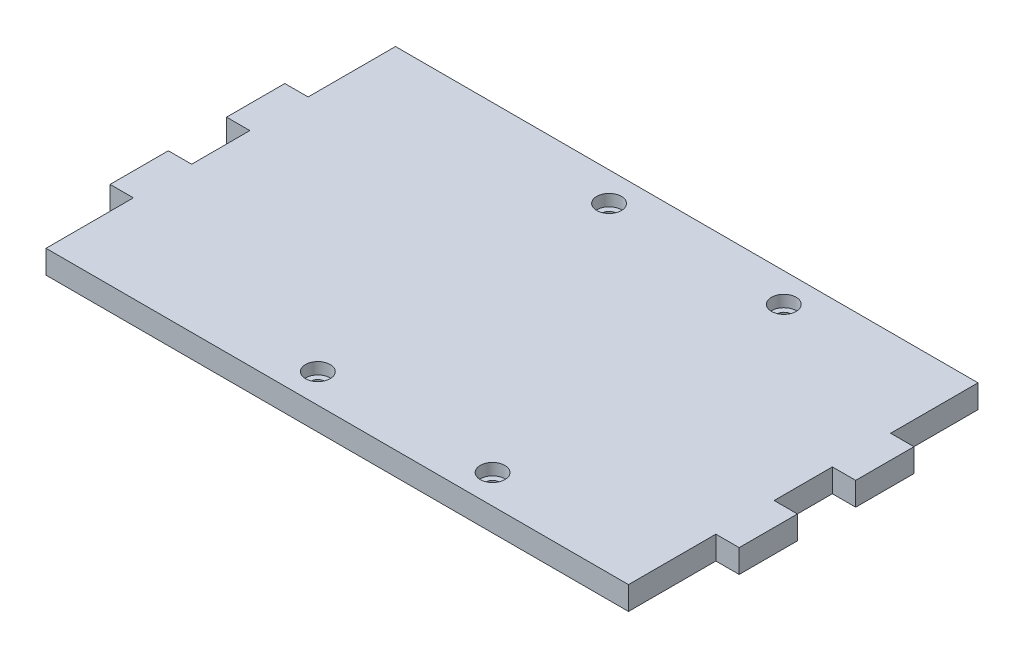
ISO-10303-21;
HEADER;
FILE_DESCRIPTION(('STEP AP214'),'2;1');
FILE_NAME('part.step','',(''),(''),'','','');
FILE_SCHEMA(('AUTOMOTIVE_DESIGN { 1 0 10303 214 1 1 1 1 }'));
ENDSEC;
DATA;
#1=APPLICATION_CONTEXT('core data for automotive mechanical design processes');
#2=APPLICATION_PROTOCOL_DEFINITION('international standard','automotive_design',2000,#1);
#3=PRODUCT_CONTEXT('',#1,'mechanical');
#4=PRODUCT('Part','Part','',(#3));
#5=PRODUCT_RELATED_PRODUCT_CATEGORY('part','',(#4));
#6=PRODUCT_DEFINITION_FORMATION('','',#4);
#7=PRODUCT_DEFINITION_CONTEXT('part definition',#1,'design');
#8=PRODUCT_DEFINITION('design','',#6,#7);
#9=PRODUCT_DEFINITION_SHAPE('','',#8);
#10=(LENGTH_UNIT() NAMED_UNIT(*) SI_UNIT(.MILLI.,.METRE.));
#11=(NAMED_UNIT(*) PLANE_ANGLE_UNIT() SI_UNIT($,.RADIAN.));
#12=(NAMED_UNIT(*) SI_UNIT($,.STERADIAN.) SOLID_ANGLE_UNIT());
#13=UNCERTAINTY_MEASURE_WITH_UNIT(LENGTH_MEASURE(1.E-05),#10,'distance_accuracy_value','');
#14=(GEOMETRIC_REPRESENTATION_CONTEXT(3) GLOBAL_UNCERTAINTY_ASSIGNED_CONTEXT((#13)) GLOBAL_UNIT_ASSIGNED_CONTEXT((#10,
#11,#12)) REPRESENTATION_CONTEXT('',''));
#15=CARTESIAN_POINT('',(0.,0.,0.));
#16=DIRECTION('',(0.,0.,1.));
#17=DIRECTION('',(1.,0.,0.));
#18=AXIS2_PLACEMENT_3D('',#15,#16,#17);
#19=CARTESIAN_POINT('',(32.5,-4.94974746830584,-37.5));
#20=DIRECTION('',(0.,1.,0.));
#21=DIRECTION('',(0.,0.,1.));
#22=AXIS2_PLACEMENT_3D('',#19,#20,#21);
#23=CYLINDRICAL_SURFACE('',#22,1.75);
#24=CARTESIAN_POINT('',(32.5,0.,-37.5));
#25=DIRECTION('',(0.,-1.,0.));
#26=DIRECTION('',(0.,0.,-1.));
#27=AXIS2_PLACEMENT_3D('',#24,#25,#26);
#28=CIRCLE('',#27,1.75);
#29=CARTESIAN_POINT('',(32.5,0.,-39.25));
#30=VERTEX_POINT('',#29);
#31=EDGE_CURVE('E220',#30,#30,#28,.F.);
#32=ORIENTED_EDGE('',*,*,#31,.F.);
#33=EDGE_LOOP('',(#32));
#34=FACE_BOUND('',#33,.T.);
#35=CARTESIAN_POINT('',(32.5,3.,-37.5));
#36=DIRECTION('',(0.,1.,0.));
#37=DIRECTION('',(0.,0.,1.));
#38=AXIS2_PLACEMENT_3D('',#35,#36,#37);
#39=CIRCLE('',#38,1.75);
#40=CARTESIAN_POINT('',(32.5,3.,-35.75));
#41=VERTEX_POINT('',#40);
#42=EDGE_CURVE('E43',#41,#41,#39,.F.);
#43=ORIENTED_EDGE('',*,*,#42,.F.);
#44=EDGE_LOOP('',(#43));
#45=FACE_BOUND('',#44,.T.);
#46=ADVANCED_FACE('F39',(#34,#45),#23,.F.);
#47=CARTESIAN_POINT('',(-12.5,-4.94974746830584,37.5));
#48=DIRECTION('',(0.,1.,0.));
#49=DIRECTION('',(0.,0.,1.));
#50=AXIS2_PLACEMENT_3D('',#47,#48,#49);
#51=CYLINDRICAL_SURFACE('',#50,1.75);
#52=CARTESIAN_POINT('',(-12.5,0.,37.5));
#53=DIRECTION('',(0.,-1.,0.));
#54=DIRECTION('',(0.,0.,-1.));
#55=AXIS2_PLACEMENT_3D('',#52,#53,#54);
#56=CIRCLE('',#55,1.75);
#57=CARTESIAN_POINT('',(-12.5,0.,35.75));
#58=VERTEX_POINT('',#57);
#59=EDGE_CURVE('E355',#58,#58,#56,.F.);
#60=ORIENTED_EDGE('',*,*,#59,.F.);
#61=EDGE_LOOP('',(#60));
#62=FACE_BOUND('',#61,.T.);
#63=CARTESIAN_POINT('',(-12.5,3.,37.5));
#64=DIRECTION('',(0.,1.,0.));
#65=DIRECTION('',(0.,0.,1.));
#66=AXIS2_PLACEMENT_3D('',#63,#64,#65);
#67=CIRCLE('',#66,1.75);
#68=CARTESIAN_POINT('',(-12.5,3.,39.25));
#69=VERTEX_POINT('',#68);
#70=EDGE_CURVE('E348',#69,#69,#67,.F.);
#71=ORIENTED_EDGE('',*,*,#70,.F.);
#72=EDGE_LOOP('',(#71));
#73=FACE_BOUND('',#72,.T.);
#74=ADVANCED_FACE('F453',(#62,#73),#51,.F.);
#75=CARTESIAN_POINT('',(32.5,-4.94974746830584,37.5));
#76=DIRECTION('',(0.,1.,0.));
#77=DIRECTION('',(0.,0.,1.));
#78=AXIS2_PLACEMENT_3D('',#75,#76,#77);
#79=CYLINDRICAL_SURFACE('',#78,1.75);
#80=CARTESIAN_POINT('',(32.5,0.,37.5));
#81=DIRECTION('',(0.,-1.,0.));
#82=DIRECTION('',(0.,0.,-1.));
#83=AXIS2_PLACEMENT_3D('',#80,#81,#82);
#84=CIRCLE('',#83,1.75);
#85=CARTESIAN_POINT('',(32.5,0.,35.75));
#86=VERTEX_POINT('',#85);
#87=EDGE_CURVE('E360',#86,#86,#84,.F.);
#88=ORIENTED_EDGE('',*,*,#87,.F.);
#89=EDGE_LOOP('',(#88));
#90=FACE_BOUND('',#89,.T.);
#91=CARTESIAN_POINT('',(32.5,3.,37.5));
#92=DIRECTION('',(0.,1.,0.));
#93=DIRECTION('',(0.,0.,1.));
#94=AXIS2_PLACEMENT_3D('',#91,#92,#93);
#95=CIRCLE('',#94,1.75);
#96=CARTESIAN_POINT('',(32.5,3.,39.25));
#97=VERTEX_POINT('',#96);
#98=EDGE_CURVE('E344',#97,#97,#95,.F.);
#99=ORIENTED_EDGE('',*,*,#98,.F.);
#100=EDGE_LOOP('',(#99));
#101=FACE_BOUND('',#100,.T.);
#102=ADVANCED_FACE('F459',(#90,#101),#79,.F.);
#103=CARTESIAN_POINT('',(-12.5,-4.94974746830584,-37.5));
#104=DIRECTION('',(0.,1.,0.));
#105=DIRECTION('',(0.,0.,1.));
#106=AXIS2_PLACEMENT_3D('',#103,#104,#105);
#107=CYLINDRICAL_SURFACE('',#106,1.75);
#108=CARTESIAN_POINT('',(-12.5,0.,-37.5));
#109=DIRECTION('',(0.,-1.,0.));
#110=DIRECTION('',(0.,0.,-1.));
#111=AXIS2_PLACEMENT_3D('',#108,#109,#110);
#112=CIRCLE('',#111,1.75);
#113=CARTESIAN_POINT('',(-12.5,0.,-39.25));
#114=VERTEX_POINT('',#113);
#115=EDGE_CURVE('E366',#114,#114,#112,.F.);
#116=ORIENTED_EDGE('',*,*,#115,.F.);
#117=EDGE_LOOP('',(#116));
#118=FACE_BOUND('',#117,.T.);
#119=CARTESIAN_POINT('',(-12.5,3.,-37.5));
#120=DIRECTION('',(0.,1.,0.));
#121=DIRECTION('',(0.,0.,1.));
#122=AXIS2_PLACEMENT_3D('',#119,#120,#121);
#123=CIRCLE('',#122,1.75);
#124=CARTESIAN_POINT('',(-12.5,3.,-35.75));
#125=VERTEX_POINT('',#124);
#126=EDGE_CURVE('E340',#125,#125,#123,.F.);
#127=ORIENTED_EDGE('',*,*,#126,.F.);
#128=EDGE_LOOP('',(#127));
#129=FACE_BOUND('',#128,.T.);
#130=ADVANCED_FACE('F482',(#118,#129),#107,.F.);
#131=CARTESIAN_POINT('',(75.,6.,-22.5));
#132=DIRECTION('',(-1.,0.,0.));
#133=DIRECTION('',(0.,0.,1.));
#134=AXIS2_PLACEMENT_3D('',#131,#132,#133);
#135=PLANE('',#134);
#136=DIRECTION('',(0.,0.,-1.));
#137=VECTOR('',#136,1.);
#138=CARTESIAN_POINT('',(75.,0.,-22.5));
#139=LINE('',#138,#137);
#140=CARTESIAN_POINT('',(75.,0.,-22.5));
#141=VERTEX_POINT('',#140);
#142=CARTESIAN_POINT('',(75.,0.,-45.));
#143=VERTEX_POINT('',#142);
#144=EDGE_CURVE('E215',#141,#143,#139,.T.);
#145=ORIENTED_EDGE('',*,*,#144,.T.);
#146=DIRECTION('',(0.,-1.,0.));
#147=VECTOR('',#146,1.);
#148=CARTESIAN_POINT('',(75.,6.,-45.));
#149=LINE('',#148,#147);
#150=CARTESIAN_POINT('',(75.,6.,-45.));
#151=VERTEX_POINT('',#150);
#152=EDGE_CURVE('E11',#151,#143,#149,.T.);
#153=ORIENTED_EDGE('',*,*,#152,.F.);
#154=DIRECTION('',(0.,0.,-1.));
#155=VECTOR('',#154,1.);
#156=CARTESIAN_POINT('',(75.,6.,-22.5));
#157=LINE('',#156,#155);
#158=CARTESIAN_POINT('',(75.,6.,-22.5));
#159=VERTEX_POINT('',#158);
#160=EDGE_CURVE('E274',#159,#151,#157,.T.);
#161=ORIENTED_EDGE('',*,*,#160,.F.);
#162=DIRECTION('',(0.,-1.,0.));
#163=VECTOR('',#162,1.);
#164=CARTESIAN_POINT('',(75.,6.,-22.5));
#165=LINE('',#164,#163);
#166=EDGE_CURVE('E211',#159,#141,#165,.T.);
#167=ORIENTED_EDGE('',*,*,#166,.T.);
#168=EDGE_LOOP('',(#145,#153,#161,#167));
#169=FACE_BOUND('',#168,.T.);
#170=ADVANCED_FACE('F41',(#169),#135,.F.);
#171=CARTESIAN_POINT('',(-75.,6.,-45.));
#172=DIRECTION('',(0.,0.,1.));
#173=DIRECTION('',(1.,0.,0.));
#174=AXIS2_PLACEMENT_3D('',#171,#172,#173);
#175=PLANE('',#174);
#176=DIRECTION('',(-1.,0.,0.));
#177=VECTOR('',#176,1.);
#178=CARTESIAN_POINT('',(-75.,0.,-45.));
#179=LINE('',#178,#177);
#180=CARTESIAN_POINT('',(-75.,0.,-45.));
#181=VERTEX_POINT('',#180);
#182=EDGE_CURVE('E219',#143,#181,#179,.T.);
#183=ORIENTED_EDGE('',*,*,#182,.T.);
#184=DIRECTION('',(0.,-1.,0.));
#185=VECTOR('',#184,1.);
#186=CARTESIAN_POINT('',(-75.,6.,-45.));
#187=LINE('',#186,#185);
#188=CARTESIAN_POINT('',(-75.,6.,-45.));
#189=VERTEX_POINT('',#188);
#190=EDGE_CURVE('E50',#189,#181,#187,.T.);
#191=ORIENTED_EDGE('',*,*,#190,.F.);
#192=DIRECTION('',(-1.,0.,0.));
#193=VECTOR('',#192,1.);
#194=CARTESIAN_POINT('',(-75.,6.,-45.));
#195=LINE('',#194,#193);
#196=EDGE_CURVE('E138',#151,#189,#195,.T.);
#197=ORIENTED_EDGE('',*,*,#196,.F.);
#198=ORIENTED_EDGE('',*,*,#152,.T.);
#199=EDGE_LOOP('',(#183,#191,#197,#198));
#200=FACE_BOUND('',#199,.T.);
#201=ADVANCED_FACE('F516',(#200),#175,.F.);
#202=CARTESIAN_POINT('',(-75.,6.,-22.5));
#203=DIRECTION('',(1.,0.,0.));
#204=DIRECTION('',(0.,0.,-1.));
#205=AXIS2_PLACEMENT_3D('',#202,#203,#204);
#206=PLANE('',#205);
#207=DIRECTION('',(0.,0.,1.));
#208=VECTOR('',#207,1.);
#209=CARTESIAN_POINT('',(-75.,0.,-22.5));
#210=LINE('',#209,#208);
#211=CARTESIAN_POINT('',(-75.,0.,-22.5));
#212=VERTEX_POINT('',#211);
#213=EDGE_CURVE('E223',#181,#212,#210,.T.);
#214=ORIENTED_EDGE('',*,*,#213,.T.);
#215=DIRECTION('',(0.,-1.,0.));
#216=VECTOR('',#215,1.);
#217=CARTESIAN_POINT('',(-75.,6.,-22.5));
#218=LINE('',#217,#216);
#219=CARTESIAN_POINT('',(-75.,6.,-22.5));
#220=VERTEX_POINT('',#219);
#221=EDGE_CURVE('E333',#220,#212,#218,.T.);
#222=ORIENTED_EDGE('',*,*,#221,.F.);
#223=DIRECTION('',(0.,0.,1.));
#224=VECTOR('',#223,1.);
#225=CARTESIAN_POINT('',(-75.,6.,-22.5));
#226=LINE('',#225,#224);
#227=EDGE_CURVE('E382',#189,#220,#226,.T.);
#228=ORIENTED_EDGE('',*,*,#227,.F.);
#229=ORIENTED_EDGE('',*,*,#190,.T.);
#230=EDGE_LOOP('',(#214,#222,#228,#229));
#231=FACE_BOUND('',#230,.T.);
#232=ADVANCED_FACE('F523',(#231),#206,.F.);
#233=CARTESIAN_POINT('',(-75.,6.,-22.5));
#234=DIRECTION('',(0.,0.,1.));
#235=DIRECTION('',(1.,0.,0.));
#236=AXIS2_PLACEMENT_3D('',#233,#234,#235);
#237=PLANE('',#236);
#238=DIRECTION('',(-1.,0.,0.));
#239=VECTOR('',#238,1.);
#240=CARTESIAN_POINT('',(-75.,0.,-22.5));
#241=LINE('',#240,#239);
#242=CARTESIAN_POINT('',(-81.,0.,-22.5));
#243=VERTEX_POINT('',#242);
#244=EDGE_CURVE('E226',#212,#243,#241,.T.);
#245=ORIENTED_EDGE('',*,*,#244,.T.);
#246=DIRECTION('',(0.,-1.,0.));
#247=VECTOR('',#246,1.);
#248=CARTESIAN_POINT('',(-81.,6.,-22.5));
#249=LINE('',#248,#247);
#250=CARTESIAN_POINT('',(-81.,6.,-22.5));
#251=VERTEX_POINT('',#250);
#252=EDGE_CURVE('E329',#251,#243,#249,.T.);
#253=ORIENTED_EDGE('',*,*,#252,.F.);
#254=DIRECTION('',(-1.,0.,0.));
#255=VECTOR('',#254,1.);
#256=CARTESIAN_POINT('',(-75.,6.,-22.5));
#257=LINE('',#256,#255);
#258=EDGE_CURVE('E385',#220,#251,#257,.T.);
#259=ORIENTED_EDGE('',*,*,#258,.F.);
#260=ORIENTED_EDGE('',*,*,#221,.T.);
#261=EDGE_LOOP('',(#245,#253,#259,#260));
#262=FACE_BOUND('',#261,.T.);
#263=ADVANCED_FACE('F527',(#262),#237,.F.);
#264=CARTESIAN_POINT('',(-81.,6.,-22.5));
#265=DIRECTION('',(1.,0.,0.));
#266=DIRECTION('',(0.,0.,-1.));
#267=AXIS2_PLACEMENT_3D('',#264,#265,#266);
#268=PLANE('',#267);
#269=DIRECTION('',(0.,0.,1.));
#270=VECTOR('',#269,1.);
#271=CARTESIAN_POINT('',(-81.,0.,-22.5));
#272=LINE('',#271,#270);
#273=CARTESIAN_POINT('',(-81.,0.,-7.50000000000003));
#274=VERTEX_POINT('',#273);
#275=EDGE_CURVE('E229',#243,#274,#272,.T.);
#276=ORIENTED_EDGE('',*,*,#275,.T.);
#277=DIRECTION('',(0.,-1.,0.));
#278=VECTOR('',#277,1.);
#279=CARTESIAN_POINT('',(-81.,6.,-7.50000000000003));
#280=LINE('',#279,#278);
#281=CARTESIAN_POINT('',(-81.,6.,-7.50000000000003));
#282=VERTEX_POINT('',#281);
#283=EDGE_CURVE('E325',#282,#274,#280,.T.);
#284=ORIENTED_EDGE('',*,*,#283,.F.);
#285=DIRECTION('',(0.,0.,1.));
#286=VECTOR('',#285,1.);
#287=CARTESIAN_POINT('',(-81.,6.,-22.5));
#288=LINE('',#287,#286);
#289=EDGE_CURVE('E388',#251,#282,#288,.T.);
#290=ORIENTED_EDGE('',*,*,#289,.F.);
#291=ORIENTED_EDGE('',*,*,#252,.T.);
#292=EDGE_LOOP('',(#276,#284,#290,#291));
#293=FACE_BOUND('',#292,.T.);
#294=ADVANCED_FACE('F533',(#293),#268,.F.);
#295=CARTESIAN_POINT('',(-75.,6.,-7.50000000000003));
#296=DIRECTION('',(0.,0.,-1.));
#297=DIRECTION('',(-1.,0.,0.));
#298=AXIS2_PLACEMENT_3D('',#295,#296,#297);
#299=PLANE('',#298);
#300=DIRECTION('',(1.,0.,0.));
#301=VECTOR('',#300,1.);
#302=CARTESIAN_POINT('',(-75.,0.,-7.50000000000003));
#303=LINE('',#302,#301);
#304=CARTESIAN_POINT('',(-75.,0.,-7.50000000000003));
#305=VERTEX_POINT('',#304);
#306=EDGE_CURVE('E232',#274,#305,#303,.T.);
#307=ORIENTED_EDGE('',*,*,#306,.T.);
#308=DIRECTION('',(0.,-1.,0.));
#309=VECTOR('',#308,1.);
#310=CARTESIAN_POINT('',(-75.,6.,-7.50000000000003));
#311=LINE('',#310,#309);
#312=CARTESIAN_POINT('',(-75.,6.,-7.50000000000003));
#313=VERTEX_POINT('',#312);
#314=EDGE_CURVE('E321',#313,#305,#311,.T.);
#315=ORIENTED_EDGE('',*,*,#314,.F.);
#316=DIRECTION('',(1.,0.,0.));
#317=VECTOR('',#316,1.);
#318=CARTESIAN_POINT('',(-75.,6.,-7.50000000000003));
#319=LINE('',#318,#317);
#320=EDGE_CURVE('E391',#282,#313,#319,.T.);
#321=ORIENTED_EDGE('',*,*,#320,.F.);
#322=ORIENTED_EDGE('',*,*,#283,.T.);
#323=EDGE_LOOP('',(#307,#315,#321,#322));
#324=FACE_BOUND('',#323,.T.);
#325=ADVANCED_FACE('F537',(#324),#299,.F.);
#326=CARTESIAN_POINT('',(-75.,6.,7.49999999999997));
#327=DIRECTION('',(1.,0.,0.));
#328=DIRECTION('',(0.,0.,-1.));
#329=AXIS2_PLACEMENT_3D('',#326,#327,#328);
#330=PLANE('',#329);
#331=DIRECTION('',(0.,0.,1.));
#332=VECTOR('',#331,1.);
#333=CARTESIAN_POINT('',(-75.,0.,7.49999999999997));
#334=LINE('',#333,#332);
#335=CARTESIAN_POINT('',(-75.,0.,7.49999999999997));
#336=VERTEX_POINT('',#335);
#337=EDGE_CURVE('E235',#305,#336,#334,.T.);
#338=ORIENTED_EDGE('',*,*,#337,.T.);
#339=DIRECTION('',(0.,-1.,0.));
#340=VECTOR('',#339,1.);
#341=CARTESIAN_POINT('',(-75.,6.,7.49999999999997));
#342=LINE('',#341,#340);
#343=CARTESIAN_POINT('',(-75.,6.,7.49999999999997));
#344=VERTEX_POINT('',#343);
#345=EDGE_CURVE('E317',#344,#336,#342,.T.);
#346=ORIENTED_EDGE('',*,*,#345,.F.);
#347=DIRECTION('',(0.,0.,1.));
#348=VECTOR('',#347,1.);
#349=CARTESIAN_POINT('',(-75.,6.,7.49999999999997));
#350=LINE('',#349,#348);
#351=EDGE_CURVE('E394',#313,#344,#350,.T.);
#352=ORIENTED_EDGE('',*,*,#351,.F.);
#353=ORIENTED_EDGE('',*,*,#314,.T.);
#354=EDGE_LOOP('',(#338,#346,#352,#353));
#355=FACE_BOUND('',#354,.T.);
#356=ADVANCED_FACE('F541',(#355),#330,.F.);
#357=CARTESIAN_POINT('',(-75.,6.,7.49999999999997));
#358=DIRECTION('',(0.,0.,1.));
#359=DIRECTION('',(1.,0.,0.));
#360=AXIS2_PLACEMENT_3D('',#357,#358,#359);
#361=PLANE('',#360);
#362=DIRECTION('',(-1.,0.,0.));
#363=VECTOR('',#362,1.);
#364=CARTESIAN_POINT('',(-75.,0.,7.49999999999997));
#365=LINE('',#364,#363);
#366=CARTESIAN_POINT('',(-81.,0.,7.49999999999997));
#367=VERTEX_POINT('',#366);
#368=EDGE_CURVE('E238',#336,#367,#365,.T.);
#369=ORIENTED_EDGE('',*,*,#368,.T.);
#370=DIRECTION('',(0.,-1.,0.));
#371=VECTOR('',#370,1.);
#372=CARTESIAN_POINT('',(-81.,6.,7.49999999999997));
#373=LINE('',#372,#371);
#374=CARTESIAN_POINT('',(-81.,6.,7.49999999999997));
#375=VERTEX_POINT('',#374);
#376=EDGE_CURVE('E313',#375,#367,#373,.T.);
#377=ORIENTED_EDGE('',*,*,#376,.F.);
#378=DIRECTION('',(-1.,0.,0.));
#379=VECTOR('',#378,1.);
#380=CARTESIAN_POINT('',(-75.,6.,7.49999999999997));
#381=LINE('',#380,#379);
#382=EDGE_CURVE('E397',#344,#375,#381,.T.);
#383=ORIENTED_EDGE('',*,*,#382,.F.);
#384=ORIENTED_EDGE('',*,*,#345,.T.);
#385=EDGE_LOOP('',(#369,#377,#383,#384));
#386=FACE_BOUND('',#385,.T.);
#387=ADVANCED_FACE('F545',(#386),#361,.F.);
#388=CARTESIAN_POINT('',(-81.,6.,7.49999999999997));
#389=DIRECTION('',(1.,0.,0.));
#390=DIRECTION('',(0.,0.,-1.));
#391=AXIS2_PLACEMENT_3D('',#388,#389,#390);
#392=PLANE('',#391);
#393=DIRECTION('',(0.,0.,1.));
#394=VECTOR('',#393,1.);
#395=CARTESIAN_POINT('',(-81.,0.,7.49999999999997));
#396=LINE('',#395,#394);
#397=CARTESIAN_POINT('',(-81.,0.,22.4999999999999));
#398=VERTEX_POINT('',#397);
#399=EDGE_CURVE('E241',#367,#398,#396,.T.);
#400=ORIENTED_EDGE('',*,*,#399,.T.);
#401=DIRECTION('',(0.,-1.,0.));
#402=VECTOR('',#401,1.);
#403=CARTESIAN_POINT('',(-81.,6.,22.4999999999999));
#404=LINE('',#403,#402);
#405=CARTESIAN_POINT('',(-81.,6.,22.4999999999999));
#406=VERTEX_POINT('',#405);
#407=EDGE_CURVE('E309',#406,#398,#404,.T.);
#408=ORIENTED_EDGE('',*,*,#407,.F.);
#409=DIRECTION('',(0.,0.,1.));
#410=VECTOR('',#409,1.);
#411=CARTESIAN_POINT('',(-81.,6.,7.49999999999997));
#412=LINE('',#411,#410);
#413=EDGE_CURVE('E400',#375,#406,#412,.T.);
#414=ORIENTED_EDGE('',*,*,#413,.F.);
#415=ORIENTED_EDGE('',*,*,#376,.T.);
#416=EDGE_LOOP('',(#400,#408,#414,#415));
#417=FACE_BOUND('',#416,.T.);
#418=ADVANCED_FACE('F549',(#417),#392,.F.);
#419=CARTESIAN_POINT('',(-75.,6.,22.4999999999999));
#420=DIRECTION('',(0.,0.,-1.));
#421=DIRECTION('',(-1.,0.,0.));
#422=AXIS2_PLACEMENT_3D('',#419,#420,#421);
#423=PLANE('',#422);
#424=DIRECTION('',(1.,0.,0.));
#425=VECTOR('',#424,1.);
#426=CARTESIAN_POINT('',(-75.,0.,22.4999999999999));
#427=LINE('',#426,#425);
#428=CARTESIAN_POINT('',(-75.,0.,22.4999999999999));
#429=VERTEX_POINT('',#428);
#430=EDGE_CURVE('E244',#398,#429,#427,.T.);
#431=ORIENTED_EDGE('',*,*,#430,.T.);
#432=DIRECTION('',(0.,-1.,0.));
#433=VECTOR('',#432,1.);
#434=CARTESIAN_POINT('',(-75.,6.,22.4999999999999));
#435=LINE('',#434,#433);
#436=CARTESIAN_POINT('',(-75.,6.,22.4999999999999));
#437=VERTEX_POINT('',#436);
#438=EDGE_CURVE('E305',#437,#429,#435,.T.);
#439=ORIENTED_EDGE('',*,*,#438,.F.);
#440=DIRECTION('',(1.,0.,0.));
#441=VECTOR('',#440,1.);
#442=CARTESIAN_POINT('',(-75.,6.,22.4999999999999));
#443=LINE('',#442,#441);
#444=EDGE_CURVE('E403',#406,#437,#443,.T.);
#445=ORIENTED_EDGE('',*,*,#444,.F.);
#446=ORIENTED_EDGE('',*,*,#407,.T.);
#447=EDGE_LOOP('',(#431,#439,#445,#446));
#448=FACE_BOUND('',#447,.T.);
#449=ADVANCED_FACE('F553',(#448),#423,.F.);
#450=CARTESIAN_POINT('',(-75.,6.,45.));
#451=DIRECTION('',(1.,0.,0.));
#452=DIRECTION('',(0.,0.,-1.));
#453=AXIS2_PLACEMENT_3D('',#450,#451,#452);
#454=PLANE('',#453);
#455=DIRECTION('',(0.,0.,1.));
#456=VECTOR('',#455,1.);
#457=CARTESIAN_POINT('',(-75.,0.,45.));
#458=LINE('',#457,#456);
#459=CARTESIAN_POINT('',(-75.,0.,45.));
#460=VERTEX_POINT('',#459);
#461=EDGE_CURVE('E247',#429,#460,#458,.T.);
#462=ORIENTED_EDGE('',*,*,#461,.T.);
#463=DIRECTION('',(0.,-1.,0.));
#464=VECTOR('',#463,1.);
#465=CARTESIAN_POINT('',(-75.,6.,45.));
#466=LINE('',#465,#464);
#467=CARTESIAN_POINT('',(-75.,6.,45.));
#468=VERTEX_POINT('',#467);
#469=EDGE_CURVE('E301',#468,#460,#466,.T.);
#470=ORIENTED_EDGE('',*,*,#469,.F.);
#471=DIRECTION('',(0.,0.,1.));
#472=VECTOR('',#471,1.);
#473=CARTESIAN_POINT('',(-75.,6.,45.));
#474=LINE('',#473,#472);
#475=EDGE_CURVE('E406',#437,#468,#474,.T.);
#476=ORIENTED_EDGE('',*,*,#475,.F.);
#477=ORIENTED_EDGE('',*,*,#438,.T.);
#478=EDGE_LOOP('',(#462,#470,#476,#477));
#479=FACE_BOUND('',#478,.T.);
#480=ADVANCED_FACE('F557',(#479),#454,.F.);
#481=CARTESIAN_POINT('',(-75.,6.,45.));
#482=DIRECTION('',(0.,0.,-1.));
#483=DIRECTION('',(-1.,0.,0.));
#484=AXIS2_PLACEMENT_3D('',#481,#482,#483);
#485=PLANE('',#484);
#486=DIRECTION('',(1.,0.,0.));
#487=VECTOR('',#486,1.);
#488=CARTESIAN_POINT('',(-75.,0.,45.));
#489=LINE('',#488,#487);
#490=CARTESIAN_POINT('',(75.,0.,45.));
#491=VERTEX_POINT('',#490);
#492=EDGE_CURVE('E250',#460,#491,#489,.T.);
#493=ORIENTED_EDGE('',*,*,#492,.T.);
#494=DIRECTION('',(0.,-1.,0.));
#495=VECTOR('',#494,1.);
#496=CARTESIAN_POINT('',(75.,6.,45.));
#497=LINE('',#496,#495);
#498=CARTESIAN_POINT('',(75.,6.,45.));
#499=VERTEX_POINT('',#498);
#500=EDGE_CURVE('E297',#499,#491,#497,.T.);
#501=ORIENTED_EDGE('',*,*,#500,.F.);
#502=DIRECTION('',(1.,0.,0.));
#503=VECTOR('',#502,1.);
#504=CARTESIAN_POINT('',(-75.,6.,45.));
#505=LINE('',#504,#503);
#506=EDGE_CURVE('E409',#468,#499,#505,.T.);
#507=ORIENTED_EDGE('',*,*,#506,.F.);
#508=ORIENTED_EDGE('',*,*,#469,.T.);
#509=EDGE_LOOP('',(#493,#501,#507,#508));
#510=FACE_BOUND('',#509,.T.);
#511=ADVANCED_FACE('F561',(#510),#485,.F.);
#512=CARTESIAN_POINT('',(75.,6.,45.));
#513=DIRECTION('',(-1.,0.,0.));
#514=DIRECTION('',(0.,0.,1.));
#515=AXIS2_PLACEMENT_3D('',#512,#513,#514);
#516=PLANE('',#515);
#517=DIRECTION('',(0.,0.,-1.));
#518=VECTOR('',#517,1.);
#519=CARTESIAN_POINT('',(75.,0.,45.));
#520=LINE('',#519,#518);
#521=CARTESIAN_POINT('',(75.,0.,22.5));
#522=VERTEX_POINT('',#521);
#523=EDGE_CURVE('E253',#491,#522,#520,.T.);
#524=ORIENTED_EDGE('',*,*,#523,.T.);
#525=DIRECTION('',(0.,-1.,0.));
#526=VECTOR('',#525,1.);
#527=CARTESIAN_POINT('',(75.,6.,22.5));
#528=LINE('',#527,#526);
#529=CARTESIAN_POINT('',(75.,6.,22.5));
#530=VERTEX_POINT('',#529);
#531=EDGE_CURVE('E293',#530,#522,#528,.T.);
#532=ORIENTED_EDGE('',*,*,#531,.F.);
#533=DIRECTION('',(0.,0.,-1.));
#534=VECTOR('',#533,1.);
#535=CARTESIAN_POINT('',(75.,6.,45.));
#536=LINE('',#535,#534);
#537=EDGE_CURVE('E412',#499,#530,#536,.T.);
#538=ORIENTED_EDGE('',*,*,#537,.F.);
#539=ORIENTED_EDGE('',*,*,#500,.T.);
#540=EDGE_LOOP('',(#524,#532,#538,#539));
#541=FACE_BOUND('',#540,.T.);
#542=ADVANCED_FACE('F565',(#541),#516,.F.);
#543=CARTESIAN_POINT('',(75.,6.,22.5));
#544=DIRECTION('',(0.,0.,-1.));
#545=DIRECTION('',(-1.,0.,0.));
#546=AXIS2_PLACEMENT_3D('',#543,#544,#545);
#547=PLANE('',#546);
#548=DIRECTION('',(1.,0.,0.));
#549=VECTOR('',#548,1.);
#550=CARTESIAN_POINT('',(75.,0.,22.5));
#551=LINE('',#550,#549);
#552=CARTESIAN_POINT('',(81.,0.,22.5));
#553=VERTEX_POINT('',#552);
#554=EDGE_CURVE('E256',#522,#553,#551,.T.);
#555=ORIENTED_EDGE('',*,*,#554,.T.);
#556=DIRECTION('',(0.,-1.,0.));
#557=VECTOR('',#556,1.);
#558=CARTESIAN_POINT('',(81.,6.,22.5));
#559=LINE('',#558,#557);
#560=CARTESIAN_POINT('',(81.,6.,22.5));
#561=VERTEX_POINT('',#560);
#562=EDGE_CURVE('E289',#561,#553,#559,.T.);
#563=ORIENTED_EDGE('',*,*,#562,.F.);
#564=DIRECTION('',(1.,0.,0.));
#565=VECTOR('',#564,1.);
#566=CARTESIAN_POINT('',(75.,6.,22.5));
#567=LINE('',#566,#565);
#568=EDGE_CURVE('E415',#530,#561,#567,.T.);
#569=ORIENTED_EDGE('',*,*,#568,.F.);
#570=ORIENTED_EDGE('',*,*,#531,.T.);
#571=EDGE_LOOP('',(#555,#563,#569,#570));
#572=FACE_BOUND('',#571,.T.);
#573=ADVANCED_FACE('F569',(#572),#547,.F.);
#574=CARTESIAN_POINT('',(81.,6.,7.5));
#575=DIRECTION('',(-1.,0.,0.));
#576=DIRECTION('',(0.,0.,1.));
#577=AXIS2_PLACEMENT_3D('',#574,#575,#576);
#578=PLANE('',#577);
#579=DIRECTION('',(0.,0.,-1.));
#580=VECTOR('',#579,1.);
#581=CARTESIAN_POINT('',(81.,0.,7.5));
#582=LINE('',#581,#580);
#583=CARTESIAN_POINT('',(81.,0.,7.5));
#584=VERTEX_POINT('',#583);
#585=EDGE_CURVE('E259',#553,#584,#582,.T.);
#586=ORIENTED_EDGE('',*,*,#585,.T.);
#587=DIRECTION('',(0.,-1.,0.));
#588=VECTOR('',#587,1.);
#589=CARTESIAN_POINT('',(81.,6.,7.5));
#590=LINE('',#589,#588);
#591=CARTESIAN_POINT('',(81.,6.,7.5));
#592=VERTEX_POINT('',#591);
#593=EDGE_CURVE('E285',#592,#584,#590,.T.);
#594=ORIENTED_EDGE('',*,*,#593,.F.);
#595=DIRECTION('',(0.,0.,-1.));
#596=VECTOR('',#595,1.);
#597=CARTESIAN_POINT('',(81.,6.,7.5));
#598=LINE('',#597,#596);
#599=EDGE_CURVE('E418',#561,#592,#598,.T.);
#600=ORIENTED_EDGE('',*,*,#599,.F.);
#601=ORIENTED_EDGE('',*,*,#562,.T.);
#602=EDGE_LOOP('',(#586,#594,#600,#601));
#603=FACE_BOUND('',#602,.T.);
#604=ADVANCED_FACE('F573',(#603),#578,.F.);
#605=CARTESIAN_POINT('',(75.,6.,7.5));
#606=DIRECTION('',(0.,0.,1.));
#607=DIRECTION('',(1.,0.,0.));
#608=AXIS2_PLACEMENT_3D('',#605,#606,#607);
#609=PLANE('',#608);
#610=DIRECTION('',(-1.,0.,0.));
#611=VECTOR('',#610,1.);
#612=CARTESIAN_POINT('',(75.,0.,7.5));
#613=LINE('',#612,#611);
#614=CARTESIAN_POINT('',(75.,0.,7.5));
#615=VERTEX_POINT('',#614);
#616=EDGE_CURVE('E262',#584,#615,#613,.T.);
#617=ORIENTED_EDGE('',*,*,#616,.T.);
#618=DIRECTION('',(0.,-1.,0.));
#619=VECTOR('',#618,1.);
#620=CARTESIAN_POINT('',(75.,6.,7.5));
#621=LINE('',#620,#619);
#622=CARTESIAN_POINT('',(75.,6.,7.5));
#623=VERTEX_POINT('',#622);
#624=EDGE_CURVE('E281',#623,#615,#621,.T.);
#625=ORIENTED_EDGE('',*,*,#624,.F.);
#626=DIRECTION('',(-1.,0.,0.));
#627=VECTOR('',#626,1.);
#628=CARTESIAN_POINT('',(75.,6.,7.5));
#629=LINE('',#628,#627);
#630=EDGE_CURVE('E421',#592,#623,#629,.T.);
#631=ORIENTED_EDGE('',*,*,#630,.F.);
#632=ORIENTED_EDGE('',*,*,#593,.T.);
#633=EDGE_LOOP('',(#617,#625,#631,#632));
#634=FACE_BOUND('',#633,.T.);
#635=ADVANCED_FACE('F429',(#634),#609,.F.);
#636=CARTESIAN_POINT('',(75.,6.,7.5));
#637=DIRECTION('',(-1.,0.,0.));
#638=DIRECTION('',(0.,0.,1.));
#639=AXIS2_PLACEMENT_3D('',#636,#637,#638);
#640=PLANE('',#639);
#641=DIRECTION('',(0.,0.,-1.));
#642=VECTOR('',#641,1.);
#643=CARTESIAN_POINT('',(75.,0.,7.5));
#644=LINE('',#643,#642);
#645=CARTESIAN_POINT('',(75.,0.,-7.5));
#646=VERTEX_POINT('',#645);
#647=EDGE_CURVE('E265',#615,#646,#644,.T.);
#648=ORIENTED_EDGE('',*,*,#647,.T.);
#649=DIRECTION('',(0.,-1.,0.));
#650=VECTOR('',#649,1.);
#651=CARTESIAN_POINT('',(75.,6.,-7.5));
#652=LINE('',#651,#650);
#653=CARTESIAN_POINT('',(75.,6.,-7.5));
#654=VERTEX_POINT('',#653);
#655=EDGE_CURVE('E204',#654,#646,#652,.T.);
#656=ORIENTED_EDGE('',*,*,#655,.F.);
#657=DIRECTION('',(0.,0.,-1.));
#658=VECTOR('',#657,1.);
#659=CARTESIAN_POINT('',(75.,6.,7.5));
#660=LINE('',#659,#658);
#661=EDGE_CURVE('E193',#623,#654,#660,.T.);
#662=ORIENTED_EDGE('',*,*,#661,.F.);
#663=ORIENTED_EDGE('',*,*,#624,.T.);
#664=EDGE_LOOP('',(#648,#656,#662,#663));
#665=FACE_BOUND('',#664,.T.);
#666=ADVANCED_FACE('F433',(#665),#640,.F.);
#667=CARTESIAN_POINT('',(75.,6.,-7.5));
#668=DIRECTION('',(0.,0.,-1.));
#669=DIRECTION('',(-1.,0.,0.));
#670=AXIS2_PLACEMENT_3D('',#667,#668,#669);
#671=PLANE('',#670);
#672=DIRECTION('',(1.,0.,0.));
#673=VECTOR('',#672,1.);
#674=CARTESIAN_POINT('',(75.,0.,-7.5));
#675=LINE('',#674,#673);
#676=CARTESIAN_POINT('',(81.,0.,-7.5));
#677=VERTEX_POINT('',#676);
#678=EDGE_CURVE('E202',#646,#677,#675,.T.);
#679=ORIENTED_EDGE('',*,*,#678,.T.);
#680=DIRECTION('',(0.,-1.,0.));
#681=VECTOR('',#680,1.);
#682=CARTESIAN_POINT('',(81.,6.,-7.5));
#683=LINE('',#682,#681);
#684=CARTESIAN_POINT('',(81.,6.,-7.5));
#685=VERTEX_POINT('',#684);
#686=EDGE_CURVE('E199',#685,#677,#683,.T.);
#687=ORIENTED_EDGE('',*,*,#686,.F.);
#688=DIRECTION('',(1.,0.,0.));
#689=VECTOR('',#688,1.);
#690=CARTESIAN_POINT('',(75.,6.,-7.5));
#691=LINE('',#690,#689);
#692=EDGE_CURVE('E187',#654,#685,#691,.T.);
#693=ORIENTED_EDGE('',*,*,#692,.F.);
#694=ORIENTED_EDGE('',*,*,#655,.T.);
#695=EDGE_LOOP('',(#679,#687,#693,#694));
#696=FACE_BOUND('',#695,.T.);
#697=ADVANCED_FACE('F200',(#696),#671,.F.);
#698=CARTESIAN_POINT('',(81.,6.,-22.5));
#699=DIRECTION('',(-1.,0.,0.));
#700=DIRECTION('',(0.,0.,1.));
#701=AXIS2_PLACEMENT_3D('',#698,#699,#700);
#702=PLANE('',#701);
#703=DIRECTION('',(0.,0.,-1.));
#704=VECTOR('',#703,1.);
#705=CARTESIAN_POINT('',(81.,0.,-22.5));
#706=LINE('',#705,#704);
#707=CARTESIAN_POINT('',(81.,0.,-22.5));
#708=VERTEX_POINT('',#707);
#709=EDGE_CURVE('E124',#677,#708,#706,.T.);
#710=ORIENTED_EDGE('',*,*,#709,.T.);
#711=DIRECTION('',(0.,-1.,0.));
#712=VECTOR('',#711,1.);
#713=CARTESIAN_POINT('',(81.,6.,-22.5));
#714=LINE('',#713,#712);
#715=CARTESIAN_POINT('',(81.,6.,-22.5));
#716=VERTEX_POINT('',#715);
#717=EDGE_CURVE('E205',#716,#708,#714,.T.);
#718=ORIENTED_EDGE('',*,*,#717,.F.);
#719=DIRECTION('',(0.,0.,-1.));
#720=VECTOR('',#719,1.);
#721=CARTESIAN_POINT('',(81.,6.,-22.5));
#722=LINE('',#721,#720);
#723=EDGE_CURVE('E191',#685,#716,#722,.T.);
#724=ORIENTED_EDGE('',*,*,#723,.F.);
#725=ORIENTED_EDGE('',*,*,#686,.T.);
#726=EDGE_LOOP('',(#710,#718,#724,#725));
#727=FACE_BOUND('',#726,.T.);
#728=ADVANCED_FACE('F207',(#727),#702,.F.);
#729=CARTESIAN_POINT('',(75.,6.,-22.5));
#730=DIRECTION('',(0.,0.,1.));
#731=DIRECTION('',(1.,0.,0.));
#732=AXIS2_PLACEMENT_3D('',#729,#730,#731);
#733=PLANE('',#732);
#734=DIRECTION('',(-1.,0.,0.));
#735=VECTOR('',#734,1.);
#736=CARTESIAN_POINT('',(75.,0.,-22.5));
#737=LINE('',#736,#735);
#738=EDGE_CURVE('E130',#708,#141,#737,.T.);
#739=ORIENTED_EDGE('',*,*,#738,.T.);
#740=ORIENTED_EDGE('',*,*,#166,.F.);
#741=DIRECTION('',(-1.,0.,0.));
#742=VECTOR('',#741,1.);
#743=CARTESIAN_POINT('',(75.,6.,-22.5));
#744=LINE('',#743,#742);
#745=EDGE_CURVE('E59',#716,#159,#744,.T.);
#746=ORIENTED_EDGE('',*,*,#745,.F.);
#747=ORIENTED_EDGE('',*,*,#717,.T.);
#748=EDGE_LOOP('',(#739,#740,#746,#747));
#749=FACE_BOUND('',#748,.T.);
#750=ADVANCED_FACE('F441',(#749),#733,.F.);
#751=CARTESIAN_POINT('',(0.,6.,0.));
#752=DIRECTION('',(0.,-1.,0.));
#753=DIRECTION('',(0.,0.,-1.));
#754=AXIS2_PLACEMENT_3D('',#751,#752,#753);
#755=PLANE('',#754);
#756=CARTESIAN_POINT('',(-12.5,6.,37.5));
#757=DIRECTION('',(0.,1.,0.));
#758=DIRECTION('',(0.,0.,1.));
#759=AXIS2_PLACEMENT_3D('',#756,#757,#758);
#760=CIRCLE('',#759,3.175);
#761=CARTESIAN_POINT('',(-12.5,6.,40.675));
#762=VERTEX_POINT('',#761);
#763=EDGE_CURVE('E703',#762,#762,#760,.T.);
#764=ORIENTED_EDGE('',*,*,#763,.F.);
#765=EDGE_LOOP('',(#764));
#766=FACE_BOUND('',#765,.T.);
#767=CARTESIAN_POINT('',(32.5,6.,37.5));
#768=DIRECTION('',(0.,1.,0.));
#769=DIRECTION('',(0.,0.,1.));
#770=AXIS2_PLACEMENT_3D('',#767,#768,#769);
#771=CIRCLE('',#770,3.175);
#772=CARTESIAN_POINT('',(32.5,6.,40.675));
#773=VERTEX_POINT('',#772);
#774=EDGE_CURVE('E693',#773,#773,#771,.T.);
#775=ORIENTED_EDGE('',*,*,#774,.F.);
#776=EDGE_LOOP('',(#775));
#777=FACE_BOUND('',#776,.T.);
#778=CARTESIAN_POINT('',(32.5,6.,-37.5));
#779=DIRECTION('',(0.,1.,0.));
#780=DIRECTION('',(0.,0.,1.));
#781=AXIS2_PLACEMENT_3D('',#778,#779,#780);
#782=CIRCLE('',#781,3.175);
#783=CARTESIAN_POINT('',(32.5,6.,-34.325));
#784=VERTEX_POINT('',#783);
#785=EDGE_CURVE('E685',#784,#784,#782,.T.);
#786=ORIENTED_EDGE('',*,*,#785,.F.);
#787=EDGE_LOOP('',(#786));
#788=FACE_BOUND('',#787,.T.);
#789=CARTESIAN_POINT('',(-12.5,6.,-37.5));
#790=DIRECTION('',(0.,1.,0.));
#791=DIRECTION('',(0.,0.,1.));
#792=AXIS2_PLACEMENT_3D('',#789,#790,#791);
#793=CIRCLE('',#792,3.175);
#794=CARTESIAN_POINT('',(-12.5,6.,-34.325));
#795=VERTEX_POINT('',#794);
#796=EDGE_CURVE('E370',#795,#795,#793,.T.);
#797=ORIENTED_EDGE('',*,*,#796,.F.);
#798=EDGE_LOOP('',(#797));
#799=FACE_BOUND('',#798,.T.);
#800=ORIENTED_EDGE('',*,*,#160,.T.);
#801=ORIENTED_EDGE('',*,*,#196,.T.);
#802=ORIENTED_EDGE('',*,*,#227,.T.);
#803=ORIENTED_EDGE('',*,*,#258,.T.);
#804=ORIENTED_EDGE('',*,*,#289,.T.);
#805=ORIENTED_EDGE('',*,*,#320,.T.);
#806=ORIENTED_EDGE('',*,*,#351,.T.);
#807=ORIENTED_EDGE('',*,*,#382,.T.);
#808=ORIENTED_EDGE('',*,*,#413,.T.);
#809=ORIENTED_EDGE('',*,*,#444,.T.);
#810=ORIENTED_EDGE('',*,*,#475,.T.);
#811=ORIENTED_EDGE('',*,*,#506,.T.);
#812=ORIENTED_EDGE('',*,*,#537,.T.);
#813=ORIENTED_EDGE('',*,*,#568,.T.);
#814=ORIENTED_EDGE('',*,*,#599,.T.);
#815=ORIENTED_EDGE('',*,*,#630,.T.);
#816=ORIENTED_EDGE('',*,*,#661,.T.);
#817=ORIENTED_EDGE('',*,*,#692,.T.);
#818=ORIENTED_EDGE('',*,*,#723,.T.);
#819=ORIENTED_EDGE('',*,*,#745,.T.);
#820=EDGE_LOOP('',(#800,#801,#802,#803,#804,#805,#806,#807,#808,#809,#810,#811,#812,#813,#814,
#815,#816,#817,#818,#819));
#821=FACE_BOUND('',#820,.T.);
#822=ADVANCED_FACE('F189',(#766,#777,#788,#799,#821),#755,.F.);
#823=CARTESIAN_POINT('',(0.,0.,0.));
#824=DIRECTION('',(0.,-1.,0.));
#825=DIRECTION('',(0.,0.,-1.));
#826=AXIS2_PLACEMENT_3D('',#823,#824,#825);
#827=PLANE('',#826);
#828=ORIENTED_EDGE('',*,*,#115,.T.);
#829=EDGE_LOOP('',(#828));
#830=FACE_BOUND('',#829,.T.);
#831=ORIENTED_EDGE('',*,*,#87,.T.);
#832=EDGE_LOOP('',(#831));
#833=FACE_BOUND('',#832,.T.);
#834=ORIENTED_EDGE('',*,*,#59,.T.);
#835=EDGE_LOOP('',(#834));
#836=FACE_BOUND('',#835,.T.);
#837=ORIENTED_EDGE('',*,*,#31,.T.);
#838=EDGE_LOOP('',(#837));
#839=FACE_BOUND('',#838,.T.);
#840=ORIENTED_EDGE('',*,*,#144,.F.);
#841=ORIENTED_EDGE('',*,*,#738,.F.);
#842=ORIENTED_EDGE('',*,*,#709,.F.);
#843=ORIENTED_EDGE('',*,*,#678,.F.);
#844=ORIENTED_EDGE('',*,*,#647,.F.);
#845=ORIENTED_EDGE('',*,*,#616,.F.);
#846=ORIENTED_EDGE('',*,*,#585,.F.);
#847=ORIENTED_EDGE('',*,*,#554,.F.);
#848=ORIENTED_EDGE('',*,*,#523,.F.);
#849=ORIENTED_EDGE('',*,*,#492,.F.);
#850=ORIENTED_EDGE('',*,*,#461,.F.);
#851=ORIENTED_EDGE('',*,*,#430,.F.);
#852=ORIENTED_EDGE('',*,*,#399,.F.);
#853=ORIENTED_EDGE('',*,*,#368,.F.);
#854=ORIENTED_EDGE('',*,*,#337,.F.);
#855=ORIENTED_EDGE('',*,*,#306,.F.);
#856=ORIENTED_EDGE('',*,*,#275,.F.);
#857=ORIENTED_EDGE('',*,*,#244,.F.);
#858=ORIENTED_EDGE('',*,*,#213,.F.);
#859=ORIENTED_EDGE('',*,*,#182,.F.);
#860=EDGE_LOOP('',(#840,#841,#842,#843,#844,#845,#846,#847,#848,#849,#850,#851,#852,#853,#854,
#855,#856,#857,#858,#859));
#861=FACE_BOUND('',#860,.T.);
#862=ADVANCED_FACE('F436',(#830,#833,#836,#839,#861),#827,.T.);
#863=CARTESIAN_POINT('',(-12.5,3.,-37.5));
#864=DIRECTION('',(0.,1.,0.));
#865=DIRECTION('',(0.,0.,1.));
#866=AXIS2_PLACEMENT_3D('',#863,#864,#865);
#867=PLANE('',#866);
#868=CARTESIAN_POINT('',(-12.5,3.,-37.5));
#869=DIRECTION('',(0.,1.,0.));
#870=DIRECTION('',(0.,0.,1.));
#871=AXIS2_PLACEMENT_3D('',#868,#869,#870);
#872=CIRCLE('',#871,3.175);
#873=CARTESIAN_POINT('',(-12.5,3.,-34.325));
#874=VERTEX_POINT('',#873);
#875=EDGE_CURVE('E345',#874,#874,#872,.T.);
#876=ORIENTED_EDGE('',*,*,#875,.T.);
#877=EDGE_LOOP('',(#876));
#878=FACE_BOUND('',#877,.T.);
#879=ORIENTED_EDGE('',*,*,#126,.T.);
#880=EDGE_LOOP('',(#879));
#881=FACE_BOUND('',#880,.T.);
#882=ADVANCED_FACE('F467',(#878,#881),#867,.T.);
#883=CARTESIAN_POINT('',(-12.5,3.,-37.5));
#884=DIRECTION('',(0.,1.,0.));
#885=DIRECTION('',(0.,0.,1.));
#886=AXIS2_PLACEMENT_3D('',#883,#884,#885);
#887=CYLINDRICAL_SURFACE('',#886,3.175);
#888=ORIENTED_EDGE('',*,*,#875,.F.);
#889=EDGE_LOOP('',(#888));
#890=FACE_BOUND('',#889,.T.);
#891=ORIENTED_EDGE('',*,*,#796,.T.);
#892=EDGE_LOOP('',(#891));
#893=FACE_BOUND('',#892,.T.);
#894=ADVANCED_FACE('F472',(#890,#893),#887,.F.);
#895=CARTESIAN_POINT('',(32.5,3.,37.5));
#896=DIRECTION('',(0.,1.,0.));
#897=DIRECTION('',(0.,0.,1.));
#898=AXIS2_PLACEMENT_3D('',#895,#896,#897);
#899=PLANE('',#898);
#900=CARTESIAN_POINT('',(32.5,3.,37.5));
#901=DIRECTION('',(0.,1.,0.));
#902=DIRECTION('',(0.,0.,1.));
#903=AXIS2_PLACEMENT_3D('',#900,#901,#902);
#904=CIRCLE('',#903,3.175);
#905=CARTESIAN_POINT('',(32.5,3.,40.675));
#906=VERTEX_POINT('',#905);
#907=EDGE_CURVE('E688',#906,#906,#904,.T.);
#908=ORIENTED_EDGE('',*,*,#907,.T.);
#909=EDGE_LOOP('',(#908));
#910=FACE_BOUND('',#909,.T.);
#911=ORIENTED_EDGE('',*,*,#98,.T.);
#912=EDGE_LOOP('',(#911));
#913=FACE_BOUND('',#912,.T.);
#914=ADVANCED_FACE('F485',(#910,#913),#899,.T.);
#915=CARTESIAN_POINT('',(32.5,3.,37.5));
#916=DIRECTION('',(0.,1.,0.));
#917=DIRECTION('',(0.,0.,1.));
#918=AXIS2_PLACEMENT_3D('',#915,#916,#917);
#919=CYLINDRICAL_SURFACE('',#918,3.175);
#920=ORIENTED_EDGE('',*,*,#907,.F.);
#921=EDGE_LOOP('',(#920));
#922=FACE_BOUND('',#921,.T.);
#923=ORIENTED_EDGE('',*,*,#774,.T.);
#924=EDGE_LOOP('',(#923));
#925=FACE_BOUND('',#924,.T.);
#926=ADVANCED_FACE('F487',(#922,#925),#919,.F.);
#927=CARTESIAN_POINT('',(-12.5,3.,37.5));
#928=DIRECTION('',(0.,1.,0.));
#929=DIRECTION('',(0.,0.,1.));
#930=AXIS2_PLACEMENT_3D('',#927,#928,#929);
#931=PLANE('',#930);
#932=CARTESIAN_POINT('',(-12.5,3.,37.5));
#933=DIRECTION('',(0.,1.,0.));
#934=DIRECTION('',(0.,0.,1.));
#935=AXIS2_PLACEMENT_3D('',#932,#933,#934);
#936=CIRCLE('',#935,3.175);
#937=CARTESIAN_POINT('',(-12.5,3.,40.675));
#938=VERTEX_POINT('',#937);
#939=EDGE_CURVE('E699',#938,#938,#936,.T.);
#940=ORIENTED_EDGE('',*,*,#939,.T.);
#941=EDGE_LOOP('',(#940));
#942=FACE_BOUND('',#941,.T.);
#943=ORIENTED_EDGE('',*,*,#70,.T.);
#944=EDGE_LOOP('',(#943));
#945=FACE_BOUND('',#944,.T.);
#946=ADVANCED_FACE('F494',(#942,#945),#931,.T.);
#947=CARTESIAN_POINT('',(-12.5,3.,37.5));
#948=DIRECTION('',(0.,1.,0.));
#949=DIRECTION('',(0.,0.,1.));
#950=AXIS2_PLACEMENT_3D('',#947,#948,#949);
#951=CYLINDRICAL_SURFACE('',#950,3.175);
#952=ORIENTED_EDGE('',*,*,#939,.F.);
#953=EDGE_LOOP('',(#952));
#954=FACE_BOUND('',#953,.T.);
#955=ORIENTED_EDGE('',*,*,#763,.T.);
#956=EDGE_LOOP('',(#955));
#957=FACE_BOUND('',#956,.T.);
#958=ADVANCED_FACE('F506',(#954,#957),#951,.F.);
#959=CARTESIAN_POINT('',(32.5,3.,-37.5));
#960=DIRECTION('',(0.,1.,0.));
#961=DIRECTION('',(0.,0.,1.));
#962=AXIS2_PLACEMENT_3D('',#959,#960,#961);
#963=PLANE('',#962);
#964=CARTESIAN_POINT('',(32.5,3.,-37.5));
#965=DIRECTION('',(0.,1.,0.));
#966=DIRECTION('',(0.,0.,1.));
#967=AXIS2_PLACEMENT_3D('',#964,#965,#966);
#968=CIRCLE('',#967,3.175);
#969=CARTESIAN_POINT('',(32.5,3.,-34.325));
#970=VERTEX_POINT('',#969);
#971=EDGE_CURVE('E682',#970,#970,#968,.T.);
#972=ORIENTED_EDGE('',*,*,#971,.T.);
#973=EDGE_LOOP('',(#972));
#974=FACE_BOUND('',#973,.T.);
#975=ORIENTED_EDGE('',*,*,#42,.T.);
#976=EDGE_LOOP('',(#975));
#977=FACE_BOUND('',#976,.T.);
#978=ADVANCED_FACE('F509',(#974,#977),#963,.T.);
#979=CARTESIAN_POINT('',(32.5,3.,-37.5));
#980=DIRECTION('',(0.,1.,0.));
#981=DIRECTION('',(0.,0.,1.));
#982=AXIS2_PLACEMENT_3D('',#979,#980,#981);
#983=CYLINDRICAL_SURFACE('',#982,3.175);
#984=ORIENTED_EDGE('',*,*,#971,.F.);
#985=EDGE_LOOP('',(#984));
#986=FACE_BOUND('',#985,.T.);
#987=ORIENTED_EDGE('',*,*,#785,.T.);
#988=EDGE_LOOP('',(#987));
#989=FACE_BOUND('',#988,.T.);
#990=ADVANCED_FACE('F501',(#986,#989),#983,.F.);
#991=CLOSED_SHELL('',(#46,#74,#102,#130,#170,#201,#232,#263,#294,#325,#356,#387,#418,#449,#480,
#511,#542,#573,#604,#635,#666,#697,#728,#750,#822,#862,#882,#894,#914,#926,#946,#958,#978,#990));
#992=MANIFOLD_SOLID_BREP('B2',#991);
#993=ADVANCED_BREP_SHAPE_REPRESENTATION('',(#18,#992),#14);
#994=SHAPE_DEFINITION_REPRESENTATION(#9,#993);
ENDSEC;
END-ISO-10303-21;
